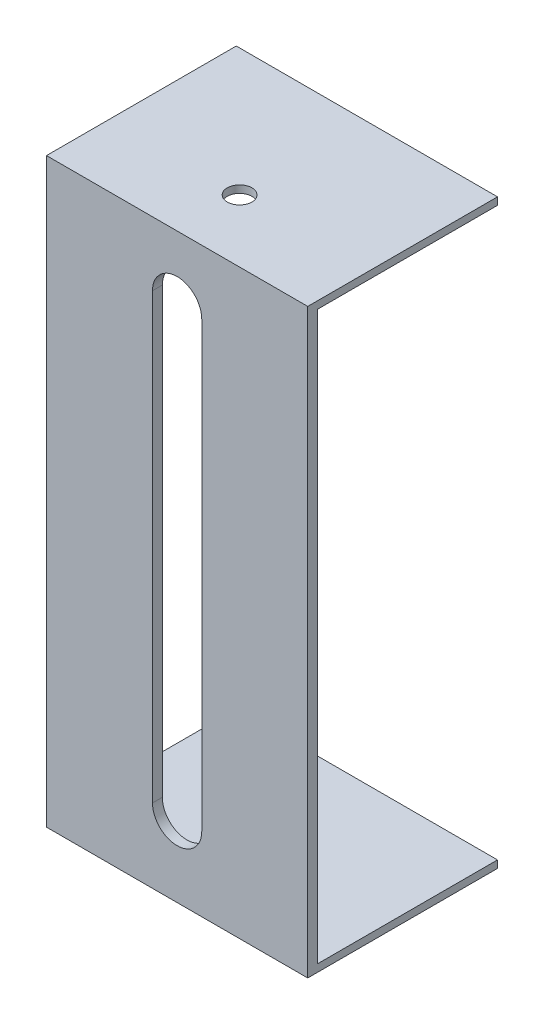
ISO-10303-21;
HEADER;
FILE_DESCRIPTION(('STEP AP214'),'2;1');
FILE_NAME('part.step','',(''),(''),'','','');
FILE_SCHEMA(('AUTOMOTIVE_DESIGN { 1 0 10303 214 1 1 1 1 }'));
ENDSEC;
DATA;
#1=APPLICATION_CONTEXT('core data for automotive mechanical design processes');
#2=APPLICATION_PROTOCOL_DEFINITION('international standard','automotive_design',2000,#1);
#3=PRODUCT_CONTEXT('',#1,'mechanical');
#4=PRODUCT('Part','Part','',(#3));
#5=PRODUCT_RELATED_PRODUCT_CATEGORY('part','',(#4));
#6=PRODUCT_DEFINITION_FORMATION('','',#4);
#7=PRODUCT_DEFINITION_CONTEXT('part definition',#1,'design');
#8=PRODUCT_DEFINITION('design','',#6,#7);
#9=PRODUCT_DEFINITION_SHAPE('','',#8);
#10=(LENGTH_UNIT() NAMED_UNIT(*) SI_UNIT(.MILLI.,.METRE.));
#11=(NAMED_UNIT(*) PLANE_ANGLE_UNIT() SI_UNIT($,.RADIAN.));
#12=(NAMED_UNIT(*) SI_UNIT($,.STERADIAN.) SOLID_ANGLE_UNIT());
#13=UNCERTAINTY_MEASURE_WITH_UNIT(LENGTH_MEASURE(1.E-05),#10,'distance_accuracy_value','');
#14=(GEOMETRIC_REPRESENTATION_CONTEXT(3) GLOBAL_UNCERTAINTY_ASSIGNED_CONTEXT((#13)) GLOBAL_UNIT_ASSIGNED_CONTEXT((#10,
#11,#12)) REPRESENTATION_CONTEXT('',''));
#15=CARTESIAN_POINT('',(0.,0.,0.));
#16=DIRECTION('',(0.,0.,1.));
#17=DIRECTION('',(1.,0.,0.));
#18=AXIS2_PLACEMENT_3D('',#15,#16,#17);
#19=CARTESIAN_POINT('',(0.,0.,0.));
#20=DIRECTION('',(0.,1.,0.));
#21=DIRECTION('',(0.,0.,1.));
#22=AXIS2_PLACEMENT_3D('',#19,#20,#21);
#23=PLANE('',#22);
#24=DIRECTION('',(-1.,0.,0.));
#25=VECTOR('',#24,1.);
#26=CARTESIAN_POINT('',(-42.,0.,-31.5));
#27=LINE('',#26,#25);
#28=CARTESIAN_POINT('',(42.,0.,-31.5));
#29=VERTEX_POINT('',#28);
#30=CARTESIAN_POINT('',(-42.,0.,-31.5));
#31=VERTEX_POINT('',#30);
#32=EDGE_CURVE('E424',#29,#31,#27,.T.);
#33=ORIENTED_EDGE('',*,*,#32,.T.);
#34=DIRECTION('',(0.,0.,1.));
#35=VECTOR('',#34,1.);
#36=CARTESIAN_POINT('',(-42.,0.,-31.5));
#37=LINE('',#36,#35);
#38=CARTESIAN_POINT('',(-42.,0.,31.5));
#39=VERTEX_POINT('',#38);
#40=EDGE_CURVE('E450',#31,#39,#37,.T.);
#41=ORIENTED_EDGE('',*,*,#40,.T.);
#42=DIRECTION('',(1.,0.,0.));
#43=VECTOR('',#42,1.);
#44=CARTESIAN_POINT('',(-42.,0.,31.5));
#45=LINE('',#44,#43);
#46=CARTESIAN_POINT('',(42.,0.,31.5));
#47=VERTEX_POINT('',#46);
#48=EDGE_CURVE('E452',#39,#47,#45,.T.);
#49=ORIENTED_EDGE('',*,*,#48,.T.);
#50=DIRECTION('',(0.,0.,-1.));
#51=VECTOR('',#50,1.);
#52=CARTESIAN_POINT('',(42.,0.,-31.5));
#53=LINE('',#52,#51);
#54=EDGE_CURVE('E431',#47,#29,#53,.T.);
#55=ORIENTED_EDGE('',*,*,#54,.T.);
#56=EDGE_LOOP('',(#33,#41,#49,#55));
#57=FACE_BOUND('',#56,.T.);
#58=DIRECTION('',(1.,0.,0.));
#59=VECTOR('',#58,1.);
#60=CARTESIAN_POINT('',(0.,0.,32.5));
#61=LINE('',#60,#59);
#62=CARTESIAN_POINT('',(-45.,0.,32.5));
#63=VERTEX_POINT('',#62);
#64=CARTESIAN_POINT('',(45.,0.,32.5));
#65=VERTEX_POINT('',#64);
#66=EDGE_CURVE('E318',#63,#65,#61,.T.);
#67=ORIENTED_EDGE('',*,*,#66,.F.);
#68=DIRECTION('',(0.,0.,1.));
#69=VECTOR('',#68,1.);
#70=CARTESIAN_POINT('',(-45.,0.,-34.5));
#71=LINE('',#70,#69);
#72=CARTESIAN_POINT('',(-45.,0.,-34.5));
#73=VERTEX_POINT('',#72);
#74=EDGE_CURVE('E476',#73,#63,#71,.T.);
#75=ORIENTED_EDGE('',*,*,#74,.F.);
#76=DIRECTION('',(-1.,0.,0.));
#77=VECTOR('',#76,1.);
#78=CARTESIAN_POINT('',(-45.,0.,-34.5));
#79=LINE('',#78,#77);
#80=CARTESIAN_POINT('',(45.,0.,-34.5));
#81=VERTEX_POINT('',#80);
#82=EDGE_CURVE('E486',#81,#73,#79,.T.);
#83=ORIENTED_EDGE('',*,*,#82,.F.);
#84=DIRECTION('',(0.,0.,-1.));
#85=VECTOR('',#84,1.);
#86=CARTESIAN_POINT('',(45.,0.,-34.5));
#87=LINE('',#86,#85);
#88=EDGE_CURVE('E472',#65,#81,#87,.T.);
#89=ORIENTED_EDGE('',*,*,#88,.F.);
#90=EDGE_LOOP('',(#67,#75,#83,#89));
#91=FACE_BOUND('',#90,.T.);
#92=ADVANCED_FACE('F50',(#57,#91),#23,.F.);
#93=CARTESIAN_POINT('',(283.034779979028,3.,34.4999999999999));
#94=DIRECTION('',(0.,0.,-1.));
#95=DIRECTION('',(-1.,0.,0.));
#96=AXIS2_PLACEMENT_3D('',#93,#94,#95);
#97=PLANE('',#96);
#98=DIRECTION('',(-1.,0.,0.));
#99=VECTOR('',#98,1.);
#100=CARTESIAN_POINT('',(0.,-219.,34.5));
#101=LINE('',#100,#99);
#102=CARTESIAN_POINT('',(45.,-219.,34.5));
#103=VERTEX_POINT('',#102);
#104=CARTESIAN_POINT('',(-45.,-219.,34.5));
#105=VERTEX_POINT('',#104);
#106=EDGE_CURVE('E301',#103,#105,#101,.T.);
#107=ORIENTED_EDGE('',*,*,#106,.F.);
#108=DIRECTION('',(0.,-1.,0.));
#109=VECTOR('',#108,1.);
#110=CARTESIAN_POINT('',(45.,3.,34.5));
#111=LINE('',#110,#109);
#112=CARTESIAN_POINT('',(45.,3.,34.5));
#113=VERTEX_POINT('',#112);
#114=EDGE_CURVE('E483',#113,#103,#111,.T.);
#115=ORIENTED_EDGE('',*,*,#114,.F.);
#116=DIRECTION('',(-1.,0.,0.));
#117=VECTOR('',#116,1.);
#118=CARTESIAN_POINT('',(283.034779979028,3.,34.4999999999999));
#119=LINE('',#118,#117);
#120=CARTESIAN_POINT('',(53.,3.,34.5));
#121=VERTEX_POINT('',#120);
#122=EDGE_CURVE('E372',#121,#113,#119,.T.);
#123=ORIENTED_EDGE('',*,*,#122,.F.);
#124=DIRECTION('',(0.,1.,0.));
#125=VECTOR('',#124,1.);
#126=CARTESIAN_POINT('',(53.,3.,34.5));
#127=LINE('',#126,#125);
#128=CARTESIAN_POINT('',(53.,-227.,34.5));
#129=VERTEX_POINT('',#128);
#130=EDGE_CURVE('E373',#129,#121,#127,.T.);
#131=ORIENTED_EDGE('',*,*,#130,.F.);
#132=DIRECTION('',(-1.,0.,0.));
#133=VECTOR('',#132,1.);
#134=CARTESIAN_POINT('',(283.034779979028,-227.,34.4999999999999));
#135=LINE('',#134,#133);
#136=CARTESIAN_POINT('',(-53.,-227.,34.5));
#137=VERTEX_POINT('',#136);
#138=EDGE_CURVE('E367',#129,#137,#135,.T.);
#139=ORIENTED_EDGE('',*,*,#138,.T.);
#140=DIRECTION('',(0.,-1.,0.));
#141=VECTOR('',#140,1.);
#142=CARTESIAN_POINT('',(-53.,3.,34.5));
#143=LINE('',#142,#141);
#144=CARTESIAN_POINT('',(-53.,3.,34.5));
#145=VERTEX_POINT('',#144);
#146=EDGE_CURVE('E347',#145,#137,#143,.T.);
#147=ORIENTED_EDGE('',*,*,#146,.F.);
#148=CARTESIAN_POINT('',(-45.,3.,34.5));
#149=VERTEX_POINT('',#148);
#150=EDGE_CURVE('E368',#149,#145,#119,.T.);
#151=ORIENTED_EDGE('',*,*,#150,.F.);
#152=DIRECTION('',(0.,-1.,0.));
#153=VECTOR('',#152,1.);
#154=CARTESIAN_POINT('',(-45.,3.,34.5));
#155=LINE('',#154,#153);
#156=EDGE_CURVE('E496',#149,#105,#155,.T.);
#157=ORIENTED_EDGE('',*,*,#156,.T.);
#158=EDGE_LOOP('',(#107,#115,#123,#131,#139,#147,#151,#157));
#159=FACE_BOUND('',#158,.T.);
#160=ADVANCED_FACE('F537',(#159),#97,.T.);
#161=CARTESIAN_POINT('',(45.,3.,-34.5));
#162=DIRECTION('',(-1.,0.,0.));
#163=DIRECTION('',(0.,0.,1.));
#164=AXIS2_PLACEMENT_3D('',#161,#162,#163);
#165=PLANE('',#164);
#166=ORIENTED_EDGE('',*,*,#114,.T.);
#167=DIRECTION('',(0.,0.,1.));
#168=VECTOR('',#167,1.);
#169=CARTESIAN_POINT('',(45.,-219.,32.5));
#170=LINE('',#169,#168);
#171=CARTESIAN_POINT('',(45.,-219.,32.5));
#172=VERTEX_POINT('',#171);
#173=EDGE_CURVE('E342',#172,#103,#170,.T.);
#174=ORIENTED_EDGE('',*,*,#173,.F.);
#175=DIRECTION('',(0.,-1.,0.));
#176=VECTOR('',#175,1.);
#177=CARTESIAN_POINT('',(45.,0.,32.5));
#178=LINE('',#177,#176);
#179=EDGE_CURVE('E324',#65,#172,#178,.T.);
#180=ORIENTED_EDGE('',*,*,#179,.F.);
#181=ORIENTED_EDGE('',*,*,#88,.T.);
#182=DIRECTION('',(0.,-1.,0.));
#183=VECTOR('',#182,1.);
#184=CARTESIAN_POINT('',(45.,3.,-34.5));
#185=LINE('',#184,#183);
#186=CARTESIAN_POINT('',(45.,3.,-34.5));
#187=VERTEX_POINT('',#186);
#188=EDGE_CURVE('E503',#187,#81,#185,.T.);
#189=ORIENTED_EDGE('',*,*,#188,.F.);
#190=DIRECTION('',(0.,0.,-1.));
#191=VECTOR('',#190,1.);
#192=CARTESIAN_POINT('',(45.,3.,-34.5));
#193=LINE('',#192,#191);
#194=EDGE_CURVE('E475',#113,#187,#193,.T.);
#195=ORIENTED_EDGE('',*,*,#194,.F.);
#196=EDGE_LOOP('',(#166,#174,#180,#181,#189,#195));
#197=FACE_BOUND('',#196,.T.);
#198=ADVANCED_FACE('F47',(#197),#165,.F.);
#199=CARTESIAN_POINT('',(-45.,3.,-34.5));
#200=DIRECTION('',(0.,0.,1.));
#201=DIRECTION('',(1.,0.,0.));
#202=AXIS2_PLACEMENT_3D('',#199,#200,#201);
#203=PLANE('',#202);
#204=ORIENTED_EDGE('',*,*,#82,.T.);
#205=DIRECTION('',(0.,-1.,0.));
#206=VECTOR('',#205,1.);
#207=CARTESIAN_POINT('',(-45.,3.,-34.5));
#208=LINE('',#207,#206);
#209=CARTESIAN_POINT('',(-45.,3.,-34.5));
#210=VERTEX_POINT('',#209);
#211=EDGE_CURVE('E497',#210,#73,#208,.T.);
#212=ORIENTED_EDGE('',*,*,#211,.F.);
#213=DIRECTION('',(-1.,0.,0.));
#214=VECTOR('',#213,1.);
#215=CARTESIAN_POINT('',(-45.,3.,-34.5));
#216=LINE('',#215,#214);
#217=EDGE_CURVE('E479',#187,#210,#216,.T.);
#218=ORIENTED_EDGE('',*,*,#217,.F.);
#219=ORIENTED_EDGE('',*,*,#188,.T.);
#220=EDGE_LOOP('',(#204,#212,#218,#219));
#221=FACE_BOUND('',#220,.T.);
#222=ADVANCED_FACE('F551',(#221),#203,.F.);
#223=CARTESIAN_POINT('',(-45.,3.,-34.5));
#224=DIRECTION('',(1.,0.,0.));
#225=DIRECTION('',(0.,0.,-1.));
#226=AXIS2_PLACEMENT_3D('',#223,#224,#225);
#227=PLANE('',#226);
#228=ORIENTED_EDGE('',*,*,#74,.T.);
#229=DIRECTION('',(0.,1.,0.));
#230=VECTOR('',#229,1.);
#231=CARTESIAN_POINT('',(-45.,0.,32.5));
#232=LINE('',#231,#230);
#233=CARTESIAN_POINT('',(-45.,-219.,32.5));
#234=VERTEX_POINT('',#233);
#235=EDGE_CURVE('E320',#234,#63,#232,.T.);
#236=ORIENTED_EDGE('',*,*,#235,.F.);
#237=DIRECTION('',(0.,0.,1.));
#238=VECTOR('',#237,1.);
#239=CARTESIAN_POINT('',(-45.,-219.,32.5));
#240=LINE('',#239,#238);
#241=EDGE_CURVE('E343',#234,#105,#240,.T.);
#242=ORIENTED_EDGE('',*,*,#241,.T.);
#243=ORIENTED_EDGE('',*,*,#156,.F.);
#244=DIRECTION('',(0.,0.,1.));
#245=VECTOR('',#244,1.);
#246=CARTESIAN_POINT('',(-45.,3.,-34.5));
#247=LINE('',#246,#245);
#248=EDGE_CURVE('E482',#210,#149,#247,.T.);
#249=ORIENTED_EDGE('',*,*,#248,.F.);
#250=ORIENTED_EDGE('',*,*,#211,.T.);
#251=EDGE_LOOP('',(#228,#236,#242,#243,#249,#250));
#252=FACE_BOUND('',#251,.T.);
#253=ADVANCED_FACE('F553',(#252),#227,.F.);
#254=CARTESIAN_POINT('',(-42.,3.,-31.5));
#255=DIRECTION('',(0.,0.,1.));
#256=DIRECTION('',(1.,0.,0.));
#257=AXIS2_PLACEMENT_3D('',#254,#255,#256);
#258=PLANE('',#257);
#259=ORIENTED_EDGE('',*,*,#32,.F.);
#260=DIRECTION('',(0.,-1.,0.));
#261=VECTOR('',#260,1.);
#262=CARTESIAN_POINT('',(42.,3.,-31.5));
#263=LINE('',#262,#261);
#264=CARTESIAN_POINT('',(42.,3.,-31.5));
#265=VERTEX_POINT('',#264);
#266=EDGE_CURVE('E442',#265,#29,#263,.T.);
#267=ORIENTED_EDGE('',*,*,#266,.F.);
#268=DIRECTION('',(-1.,0.,0.));
#269=VECTOR('',#268,1.);
#270=CARTESIAN_POINT('',(-42.,3.,-31.5));
#271=LINE('',#270,#269);
#272=CARTESIAN_POINT('',(-42.,3.,-31.5));
#273=VERTEX_POINT('',#272);
#274=EDGE_CURVE('E428',#265,#273,#271,.T.);
#275=ORIENTED_EDGE('',*,*,#274,.T.);
#276=DIRECTION('',(0.,-1.,0.));
#277=VECTOR('',#276,1.);
#278=CARTESIAN_POINT('',(-42.,3.,-31.5));
#279=LINE('',#278,#277);
#280=EDGE_CURVE('E470',#273,#31,#279,.T.);
#281=ORIENTED_EDGE('',*,*,#280,.T.);
#282=EDGE_LOOP('',(#259,#267,#275,#281));
#283=FACE_BOUND('',#282,.T.);
#284=ADVANCED_FACE('F546',(#283),#258,.T.);
#285=CARTESIAN_POINT('',(-42.,3.,-31.5));
#286=DIRECTION('',(1.,0.,0.));
#287=DIRECTION('',(0.,0.,-1.));
#288=AXIS2_PLACEMENT_3D('',#285,#286,#287);
#289=PLANE('',#288);
#290=ORIENTED_EDGE('',*,*,#40,.F.);
#291=ORIENTED_EDGE('',*,*,#280,.F.);
#292=DIRECTION('',(0.,0.,1.));
#293=VECTOR('',#292,1.);
#294=CARTESIAN_POINT('',(-42.,3.,-31.5));
#295=LINE('',#294,#293);
#296=CARTESIAN_POINT('',(-42.,3.,31.5));
#297=VERTEX_POINT('',#296);
#298=EDGE_CURVE('E427',#273,#297,#295,.T.);
#299=ORIENTED_EDGE('',*,*,#298,.T.);
#300=DIRECTION('',(0.,-1.,0.));
#301=VECTOR('',#300,1.);
#302=CARTESIAN_POINT('',(-42.,3.,31.5));
#303=LINE('',#302,#301);
#304=EDGE_CURVE('E461',#297,#39,#303,.T.);
#305=ORIENTED_EDGE('',*,*,#304,.T.);
#306=EDGE_LOOP('',(#290,#291,#299,#305));
#307=FACE_BOUND('',#306,.T.);
#308=ADVANCED_FACE('F647',(#307),#289,.T.);
#309=CARTESIAN_POINT('',(-42.,3.,31.5));
#310=DIRECTION('',(0.,0.,-1.));
#311=DIRECTION('',(-1.,0.,0.));
#312=AXIS2_PLACEMENT_3D('',#309,#310,#311);
#313=PLANE('',#312);
#314=ORIENTED_EDGE('',*,*,#48,.F.);
#315=ORIENTED_EDGE('',*,*,#304,.F.);
#316=DIRECTION('',(1.,0.,0.));
#317=VECTOR('',#316,1.);
#318=CARTESIAN_POINT('',(-42.,3.,31.5));
#319=LINE('',#318,#317);
#320=CARTESIAN_POINT('',(42.,3.,31.5));
#321=VERTEX_POINT('',#320);
#322=EDGE_CURVE('E434',#297,#321,#319,.T.);
#323=ORIENTED_EDGE('',*,*,#322,.T.);
#324=DIRECTION('',(0.,-1.,0.));
#325=VECTOR('',#324,1.);
#326=CARTESIAN_POINT('',(42.,3.,31.5));
#327=LINE('',#326,#325);
#328=EDGE_CURVE('E462',#321,#47,#327,.T.);
#329=ORIENTED_EDGE('',*,*,#328,.T.);
#330=EDGE_LOOP('',(#314,#315,#323,#329));
#331=FACE_BOUND('',#330,.T.);
#332=ADVANCED_FACE('F639',(#331),#313,.T.);
#333=CARTESIAN_POINT('',(42.,3.,-31.5));
#334=DIRECTION('',(-1.,0.,0.));
#335=DIRECTION('',(0.,0.,1.));
#336=AXIS2_PLACEMENT_3D('',#333,#334,#335);
#337=PLANE('',#336);
#338=ORIENTED_EDGE('',*,*,#54,.F.);
#339=ORIENTED_EDGE('',*,*,#328,.F.);
#340=DIRECTION('',(0.,0.,-1.));
#341=VECTOR('',#340,1.);
#342=CARTESIAN_POINT('',(42.,3.,-31.5));
#343=LINE('',#342,#341);
#344=EDGE_CURVE('E437',#321,#265,#343,.T.);
#345=ORIENTED_EDGE('',*,*,#344,.T.);
#346=ORIENTED_EDGE('',*,*,#266,.T.);
#347=EDGE_LOOP('',(#338,#339,#345,#346));
#348=FACE_BOUND('',#347,.T.);
#349=ADVANCED_FACE('F636',(#348),#337,.T.);
#350=CARTESIAN_POINT('',(0.,3.,0.));
#351=DIRECTION('',(0.,1.,0.));
#352=DIRECTION('',(0.,0.,1.));
#353=AXIS2_PLACEMENT_3D('',#350,#351,#352);
#354=PLANE('',#353);
#355=DIRECTION('',(0.,0.,-1.));
#356=VECTOR('',#355,1.);
#357=CARTESIAN_POINT('',(53.,3.,-38.5));
#358=LINE('',#357,#356);
#359=CARTESIAN_POINT('',(53.,3.,-38.5));
#360=VERTEX_POINT('',#359);
#361=EDGE_CURVE('E383',#121,#360,#358,.T.);
#362=ORIENTED_EDGE('',*,*,#361,.F.);
#363=ORIENTED_EDGE('',*,*,#122,.T.);
#364=ORIENTED_EDGE('',*,*,#194,.T.);
#365=ORIENTED_EDGE('',*,*,#217,.T.);
#366=ORIENTED_EDGE('',*,*,#248,.T.);
#367=ORIENTED_EDGE('',*,*,#150,.T.);
#368=DIRECTION('',(0.,0.,1.));
#369=VECTOR('',#368,1.);
#370=CARTESIAN_POINT('',(-53.,3.,-38.5));
#371=LINE('',#370,#369);
#372=CARTESIAN_POINT('',(-53.,3.,-38.5));
#373=VERTEX_POINT('',#372);
#374=EDGE_CURVE('E393',#373,#145,#371,.T.);
#375=ORIENTED_EDGE('',*,*,#374,.F.);
#376=DIRECTION('',(-1.,0.,0.));
#377=VECTOR('',#376,1.);
#378=CARTESIAN_POINT('',(-53.,3.,-38.5));
#379=LINE('',#378,#377);
#380=EDGE_CURVE('E407',#360,#373,#379,.T.);
#381=ORIENTED_EDGE('',*,*,#380,.F.);
#382=EDGE_LOOP('',(#362,#363,#364,#365,#366,#367,#375,#381));
#383=FACE_BOUND('',#382,.T.);
#384=ADVANCED_FACE('F578',(#383),#354,.F.);
#385=CARTESIAN_POINT('',(0.,6.,0.));
#386=DIRECTION('',(0.,1.,0.));
#387=DIRECTION('',(0.,0.,1.));
#388=AXIS2_PLACEMENT_3D('',#385,#386,#387);
#389=PLANE('',#388);
#390=DIRECTION('',(0.,0.,-1.));
#391=VECTOR('',#390,1.);
#392=CARTESIAN_POINT('',(53.,6.,-38.5));
#393=LINE('',#392,#391);
#394=CARTESIAN_POINT('',(53.,6.,38.5));
#395=VERTEX_POINT('',#394);
#396=CARTESIAN_POINT('',(53.,6.,-38.5));
#397=VERTEX_POINT('',#396);
#398=EDGE_CURVE('E386',#395,#397,#393,.T.);
#399=ORIENTED_EDGE('',*,*,#398,.T.);
#400=DIRECTION('',(-1.,0.,0.));
#401=VECTOR('',#400,1.);
#402=CARTESIAN_POINT('',(-53.,6.,-38.5));
#403=LINE('',#402,#401);
#404=CARTESIAN_POINT('',(-53.,6.,-38.5));
#405=VERTEX_POINT('',#404);
#406=EDGE_CURVE('E395',#397,#405,#403,.T.);
#407=ORIENTED_EDGE('',*,*,#406,.T.);
#408=DIRECTION('',(0.,0.,1.));
#409=VECTOR('',#408,1.);
#410=CARTESIAN_POINT('',(-53.,6.,-38.5));
#411=LINE('',#410,#409);
#412=CARTESIAN_POINT('',(-53.,6.,38.5));
#413=VERTEX_POINT('',#412);
#414=EDGE_CURVE('E400',#405,#413,#411,.T.);
#415=ORIENTED_EDGE('',*,*,#414,.T.);
#416=DIRECTION('',(1.,0.,0.));
#417=VECTOR('',#416,1.);
#418=CARTESIAN_POINT('',(-53.,6.,38.5));
#419=LINE('',#418,#417);
#420=EDGE_CURVE('E398',#413,#395,#419,.T.);
#421=ORIENTED_EDGE('',*,*,#420,.T.);
#422=EDGE_LOOP('',(#399,#407,#415,#421));
#423=FACE_BOUND('',#422,.T.);
#424=CARTESIAN_POINT('',(0.,6.,13.15));
#425=DIRECTION('',(0.,1.,0.));
#426=DIRECTION('',(0.,0.,1.));
#427=AXIS2_PLACEMENT_3D('',#424,#425,#426);
#428=CIRCLE('',#427,5.);
#429=CARTESIAN_POINT('',(0.,6.,18.15));
#430=VERTEX_POINT('',#429);
#431=EDGE_CURVE('E382',#430,#430,#428,.T.);
#432=ORIENTED_EDGE('',*,*,#431,.F.);
#433=EDGE_LOOP('',(#432));
#434=FACE_BOUND('',#433,.T.);
#435=ADVANCED_FACE('F611',(#423,#434),#389,.T.);
#436=ORIENTED_EDGE('',*,*,#298,.F.);
#437=ORIENTED_EDGE('',*,*,#274,.F.);
#438=ORIENTED_EDGE('',*,*,#344,.F.);
#439=ORIENTED_EDGE('',*,*,#322,.F.);
#440=EDGE_LOOP('',(#436,#437,#438,#439));
#441=FACE_BOUND('',#440,.T.);
#442=CARTESIAN_POINT('',(0.,3.,13.15));
#443=DIRECTION('',(0.,1.,0.));
#444=DIRECTION('',(0.,0.,1.));
#445=AXIS2_PLACEMENT_3D('',#442,#443,#444);
#446=CIRCLE('',#445,5.);
#447=CARTESIAN_POINT('',(0.,3.,18.15));
#448=VERTEX_POINT('',#447);
#449=EDGE_CURVE('E379',#448,#448,#446,.T.);
#450=ORIENTED_EDGE('',*,*,#449,.T.);
#451=EDGE_LOOP('',(#450));
#452=FACE_BOUND('',#451,.T.);
#453=ADVANCED_FACE('F617',(#441,#452),#354,.F.);
#454=CARTESIAN_POINT('',(53.,6.,-38.5));
#455=DIRECTION('',(-1.,0.,0.));
#456=DIRECTION('',(0.,0.,1.));
#457=AXIS2_PLACEMENT_3D('',#454,#455,#456);
#458=PLANE('',#457);
#459=DIRECTION('',(0.,-1.,0.));
#460=VECTOR('',#459,1.);
#461=CARTESIAN_POINT('',(53.,6.,38.5));
#462=LINE('',#461,#460);
#463=CARTESIAN_POINT('',(53.,-230.,38.5));
#464=VERTEX_POINT('',#463);
#465=EDGE_CURVE('E401',#395,#464,#462,.T.);
#466=ORIENTED_EDGE('',*,*,#465,.T.);
#467=DIRECTION('',(0.,0.,-1.));
#468=VECTOR('',#467,1.);
#469=CARTESIAN_POINT('',(53.,-230.,-38.5));
#470=LINE('',#469,#468);
#471=CARTESIAN_POINT('',(53.,-230.,-38.5));
#472=VERTEX_POINT('',#471);
#473=EDGE_CURVE('E263',#464,#472,#470,.T.);
#474=ORIENTED_EDGE('',*,*,#473,.T.);
#475=DIRECTION('',(0.,1.,0.));
#476=VECTOR('',#475,1.);
#477=CARTESIAN_POINT('',(53.,-227.,-38.5));
#478=LINE('',#477,#476);
#479=CARTESIAN_POINT('',(53.,-227.,-38.5));
#480=VERTEX_POINT('',#479);
#481=EDGE_CURVE('E275',#472,#480,#478,.T.);
#482=ORIENTED_EDGE('',*,*,#481,.T.);
#483=DIRECTION('',(0.,0.,1.));
#484=VECTOR('',#483,1.);
#485=CARTESIAN_POINT('',(53.,-227.,-38.5));
#486=LINE('',#485,#484);
#487=EDGE_CURVE('E270',#480,#129,#486,.T.);
#488=ORIENTED_EDGE('',*,*,#487,.T.);
#489=ORIENTED_EDGE('',*,*,#130,.T.);
#490=ORIENTED_EDGE('',*,*,#361,.T.);
#491=DIRECTION('',(0.,-1.,0.));
#492=VECTOR('',#491,1.);
#493=CARTESIAN_POINT('',(53.,6.,-38.5));
#494=LINE('',#493,#492);
#495=EDGE_CURVE('E423',#397,#360,#494,.T.);
#496=ORIENTED_EDGE('',*,*,#495,.F.);
#497=ORIENTED_EDGE('',*,*,#398,.F.);
#498=EDGE_LOOP('',(#466,#474,#482,#488,#489,#490,#496,#497));
#499=FACE_BOUND('',#498,.T.);
#500=ADVANCED_FACE('F593',(#499),#458,.F.);
#501=CARTESIAN_POINT('',(-53.,6.,-38.5));
#502=DIRECTION('',(0.,0.,1.));
#503=DIRECTION('',(1.,0.,0.));
#504=AXIS2_PLACEMENT_3D('',#501,#502,#503);
#505=PLANE('',#504);
#506=ORIENTED_EDGE('',*,*,#380,.T.);
#507=DIRECTION('',(0.,-1.,0.));
#508=VECTOR('',#507,1.);
#509=CARTESIAN_POINT('',(-53.,6.,-38.5));
#510=LINE('',#509,#508);
#511=EDGE_CURVE('E420',#405,#373,#510,.T.);
#512=ORIENTED_EDGE('',*,*,#511,.F.);
#513=ORIENTED_EDGE('',*,*,#406,.F.);
#514=ORIENTED_EDGE('',*,*,#495,.T.);
#515=EDGE_LOOP('',(#506,#512,#513,#514));
#516=FACE_BOUND('',#515,.T.);
#517=ADVANCED_FACE('F595',(#516),#505,.F.);
#518=CARTESIAN_POINT('',(-53.,6.,-38.5));
#519=DIRECTION('',(1.,0.,0.));
#520=DIRECTION('',(0.,0.,-1.));
#521=AXIS2_PLACEMENT_3D('',#518,#519,#520);
#522=PLANE('',#521);
#523=ORIENTED_EDGE('',*,*,#374,.T.);
#524=ORIENTED_EDGE('',*,*,#146,.T.);
#525=DIRECTION('',(0.,0.,-1.));
#526=VECTOR('',#525,1.);
#527=CARTESIAN_POINT('',(-53.,-227.,-38.5));
#528=LINE('',#527,#526);
#529=CARTESIAN_POINT('',(-53.,-227.,-38.5));
#530=VERTEX_POINT('',#529);
#531=EDGE_CURVE('E265',#137,#530,#528,.T.);
#532=ORIENTED_EDGE('',*,*,#531,.T.);
#533=DIRECTION('',(0.,-1.,0.));
#534=VECTOR('',#533,1.);
#535=CARTESIAN_POINT('',(-53.,-227.,-38.5));
#536=LINE('',#535,#534);
#537=CARTESIAN_POINT('',(-53.,-230.,-38.5));
#538=VERTEX_POINT('',#537);
#539=EDGE_CURVE('E273',#530,#538,#536,.T.);
#540=ORIENTED_EDGE('',*,*,#539,.T.);
#541=DIRECTION('',(0.,0.,1.));
#542=VECTOR('',#541,1.);
#543=CARTESIAN_POINT('',(-53.,-230.,-38.5));
#544=LINE('',#543,#542);
#545=CARTESIAN_POINT('',(-53.,-230.,38.5));
#546=VERTEX_POINT('',#545);
#547=EDGE_CURVE('E276',#538,#546,#544,.T.);
#548=ORIENTED_EDGE('',*,*,#547,.T.);
#549=DIRECTION('',(0.,-1.,0.));
#550=VECTOR('',#549,1.);
#551=CARTESIAN_POINT('',(-53.,6.,38.5));
#552=LINE('',#551,#550);
#553=EDGE_CURVE('E413',#413,#546,#552,.T.);
#554=ORIENTED_EDGE('',*,*,#553,.F.);
#555=ORIENTED_EDGE('',*,*,#414,.F.);
#556=ORIENTED_EDGE('',*,*,#511,.T.);
#557=EDGE_LOOP('',(#523,#524,#532,#540,#548,#554,#555,#556));
#558=FACE_BOUND('',#557,.T.);
#559=ADVANCED_FACE('F589',(#558),#522,.F.);
#560=CARTESIAN_POINT('',(-53.,6.,38.5));
#561=DIRECTION('',(0.,0.,-1.));
#562=DIRECTION('',(-1.,0.,0.));
#563=AXIS2_PLACEMENT_3D('',#560,#561,#562);
#564=PLANE('',#563);
#565=DIRECTION('',(0.,-1.,0.));
#566=VECTOR('',#565,1.);
#567=CARTESIAN_POINT('',(-10.,-20.0000000000002,38.5));
#568=LINE('',#567,#566);
#569=CARTESIAN_POINT('',(-10.,-20.0000000000002,38.5));
#570=VERTEX_POINT('',#569);
#571=CARTESIAN_POINT('',(-9.99999999999999,-200.,38.5));
#572=VERTEX_POINT('',#571);
#573=EDGE_CURVE('E231',#570,#572,#568,.T.);
#574=ORIENTED_EDGE('',*,*,#573,.F.);
#575=CARTESIAN_POINT('',(0.,-20.0000000000002,38.5));
#576=DIRECTION('',(0.,0.,1.));
#577=DIRECTION('',(1.,0.,0.));
#578=AXIS2_PLACEMENT_3D('',#575,#576,#577);
#579=CIRCLE('',#578,10.);
#580=CARTESIAN_POINT('',(10.,-20.0000000000002,38.5));
#581=VERTEX_POINT('',#580);
#582=EDGE_CURVE('E64',#581,#570,#579,.T.);
#583=ORIENTED_EDGE('',*,*,#582,.F.);
#584=DIRECTION('',(0.,1.,0.));
#585=VECTOR('',#584,1.);
#586=CARTESIAN_POINT('',(10.,-20.0000000000002,38.5));
#587=LINE('',#586,#585);
#588=CARTESIAN_POINT('',(10.,-200.,38.5));
#589=VERTEX_POINT('',#588);
#590=EDGE_CURVE('E241',#589,#581,#587,.T.);
#591=ORIENTED_EDGE('',*,*,#590,.F.);
#592=CARTESIAN_POINT('',(0.,-200.,38.5));
#593=DIRECTION('',(0.,0.,1.));
#594=DIRECTION('',(1.,0.,0.));
#595=AXIS2_PLACEMENT_3D('',#592,#593,#594);
#596=CIRCLE('',#595,10.);
#597=EDGE_CURVE('E224',#572,#589,#596,.T.);
#598=ORIENTED_EDGE('',*,*,#597,.F.);
#599=EDGE_LOOP('',(#574,#583,#591,#598));
#600=FACE_BOUND('',#599,.T.);
#601=ORIENTED_EDGE('',*,*,#553,.T.);
#602=DIRECTION('',(-1.,0.,0.));
#603=VECTOR('',#602,1.);
#604=CARTESIAN_POINT('',(130.058419397234,-230.,38.5));
#605=LINE('',#604,#603);
#606=EDGE_CURVE('E269',#464,#546,#605,.T.);
#607=ORIENTED_EDGE('',*,*,#606,.F.);
#608=ORIENTED_EDGE('',*,*,#465,.F.);
#609=ORIENTED_EDGE('',*,*,#420,.F.);
#610=EDGE_LOOP('',(#601,#607,#608,#609));
#611=FACE_BOUND('',#610,.T.);
#612=ADVANCED_FACE('F238',(#600,#611),#564,.F.);
#613=CARTESIAN_POINT('',(0.,6.,13.15));
#614=DIRECTION('',(0.,-1.,0.));
#615=DIRECTION('',(0.,0.,-1.));
#616=AXIS2_PLACEMENT_3D('',#613,#614,#615);
#617=CYLINDRICAL_SURFACE('',#616,5.);
#618=ORIENTED_EDGE('',*,*,#431,.T.);
#619=EDGE_LOOP('',(#618));
#620=FACE_BOUND('',#619,.T.);
#621=ORIENTED_EDGE('',*,*,#449,.F.);
#622=EDGE_LOOP('',(#621));
#623=FACE_BOUND('',#622,.T.);
#624=ADVANCED_FACE('F623',(#620,#623),#617,.F.);
#625=CARTESIAN_POINT('',(0.,-219.,32.5));
#626=DIRECTION('',(0.,1.,0.));
#627=DIRECTION('',(0.,0.,1.));
#628=AXIS2_PLACEMENT_3D('',#625,#626,#627);
#629=PLANE('',#628);
#630=ORIENTED_EDGE('',*,*,#106,.T.);
#631=ORIENTED_EDGE('',*,*,#241,.F.);
#632=DIRECTION('',(-1.,0.,0.));
#633=VECTOR('',#632,1.);
#634=CARTESIAN_POINT('',(0.,-219.,32.5));
#635=LINE('',#634,#633);
#636=EDGE_CURVE('E312',#172,#234,#635,.T.);
#637=ORIENTED_EDGE('',*,*,#636,.F.);
#638=ORIENTED_EDGE('',*,*,#173,.T.);
#639=EDGE_LOOP('',(#630,#631,#637,#638));
#640=FACE_BOUND('',#639,.T.);
#641=ADVANCED_FACE('F580',(#640),#629,.F.);
#642=CARTESIAN_POINT('',(0.,-3.,32.5));
#643=DIRECTION('',(0.,-1.,0.));
#644=DIRECTION('',(0.,0.,-1.));
#645=AXIS2_PLACEMENT_3D('',#642,#643,#644);
#646=PLANE('',#645);
#647=DIRECTION('',(1.,0.,0.));
#648=VECTOR('',#647,1.);
#649=CARTESIAN_POINT('',(0.,-3.,34.5));
#650=LINE('',#649,#648);
#651=CARTESIAN_POINT('',(-42.,-3.,34.5));
#652=VERTEX_POINT('',#651);
#653=CARTESIAN_POINT('',(42.,-3.,34.5));
#654=VERTEX_POINT('',#653);
#655=EDGE_CURVE('E294',#652,#654,#650,.T.);
#656=ORIENTED_EDGE('',*,*,#655,.F.);
#657=DIRECTION('',(0.,0.,1.));
#658=VECTOR('',#657,1.);
#659=CARTESIAN_POINT('',(-42.,-3.,32.5));
#660=LINE('',#659,#658);
#661=CARTESIAN_POINT('',(-42.,-3.,32.5));
#662=VERTEX_POINT('',#661);
#663=EDGE_CURVE('E349',#662,#652,#660,.T.);
#664=ORIENTED_EDGE('',*,*,#663,.F.);
#665=DIRECTION('',(1.,0.,0.));
#666=VECTOR('',#665,1.);
#667=CARTESIAN_POINT('',(0.,-3.,32.5));
#668=LINE('',#667,#666);
#669=CARTESIAN_POINT('',(42.,-3.,32.5));
#670=VERTEX_POINT('',#669);
#671=EDGE_CURVE('E298',#662,#670,#668,.T.);
#672=ORIENTED_EDGE('',*,*,#671,.T.);
#673=DIRECTION('',(0.,0.,1.));
#674=VECTOR('',#673,1.);
#675=CARTESIAN_POINT('',(42.,-3.,32.5));
#676=LINE('',#675,#674);
#677=EDGE_CURVE('E329',#670,#654,#676,.T.);
#678=ORIENTED_EDGE('',*,*,#677,.T.);
#679=EDGE_LOOP('',(#656,#664,#672,#678));
#680=FACE_BOUND('',#679,.T.);
#681=ADVANCED_FACE('F762',(#680),#646,.T.);
#682=CARTESIAN_POINT('',(-42.,0.,32.5));
#683=DIRECTION('',(1.,0.,0.));
#684=DIRECTION('',(0.,0.,-1.));
#685=AXIS2_PLACEMENT_3D('',#682,#683,#684);
#686=PLANE('',#685);
#687=DIRECTION('',(0.,1.,0.));
#688=VECTOR('',#687,1.);
#689=CARTESIAN_POINT('',(-42.,0.,34.5));
#690=LINE('',#689,#688);
#691=CARTESIAN_POINT('',(-42.,-216.,34.5));
#692=VERTEX_POINT('',#691);
#693=EDGE_CURVE('E328',#692,#652,#690,.T.);
#694=ORIENTED_EDGE('',*,*,#693,.F.);
#695=DIRECTION('',(0.,0.,1.));
#696=VECTOR('',#695,1.);
#697=CARTESIAN_POINT('',(-42.,-216.,32.5));
#698=LINE('',#697,#696);
#699=CARTESIAN_POINT('',(-42.,-216.,32.5));
#700=VERTEX_POINT('',#699);
#701=EDGE_CURVE('E356',#700,#692,#698,.T.);
#702=ORIENTED_EDGE('',*,*,#701,.F.);
#703=DIRECTION('',(0.,1.,0.));
#704=VECTOR('',#703,1.);
#705=CARTESIAN_POINT('',(-42.,0.,32.5));
#706=LINE('',#705,#704);
#707=EDGE_CURVE('E297',#700,#662,#706,.T.);
#708=ORIENTED_EDGE('',*,*,#707,.T.);
#709=ORIENTED_EDGE('',*,*,#663,.T.);
#710=EDGE_LOOP('',(#694,#702,#708,#709));
#711=FACE_BOUND('',#710,.T.);
#712=ADVANCED_FACE('F775',(#711),#686,.T.);
#713=CARTESIAN_POINT('',(0.,-216.,32.5));
#714=DIRECTION('',(0.,1.,0.));
#715=DIRECTION('',(-1.,0.,0.));
#716=AXIS2_PLACEMENT_3D('',#713,#714,#715);
#717=PLANE('',#716);
#718=DIRECTION('',(-1.,0.,0.));
#719=VECTOR('',#718,1.);
#720=CARTESIAN_POINT('',(0.,-216.,34.5));
#721=LINE('',#720,#719);
#722=CARTESIAN_POINT('',(42.,-216.,34.5));
#723=VERTEX_POINT('',#722);
#724=EDGE_CURVE('E335',#723,#692,#721,.T.);
#725=ORIENTED_EDGE('',*,*,#724,.F.);
#726=DIRECTION('',(0.,0.,1.));
#727=VECTOR('',#726,1.);
#728=CARTESIAN_POINT('',(42.,-216.,32.5));
#729=LINE('',#728,#727);
#730=CARTESIAN_POINT('',(42.,-216.,32.5));
#731=VERTEX_POINT('',#730);
#732=EDGE_CURVE('E351',#731,#723,#729,.T.);
#733=ORIENTED_EDGE('',*,*,#732,.F.);
#734=DIRECTION('',(-1.,0.,0.));
#735=VECTOR('',#734,1.);
#736=CARTESIAN_POINT('',(0.,-216.,32.5));
#737=LINE('',#736,#735);
#738=EDGE_CURVE('E304',#731,#700,#737,.T.);
#739=ORIENTED_EDGE('',*,*,#738,.T.);
#740=ORIENTED_EDGE('',*,*,#701,.T.);
#741=EDGE_LOOP('',(#725,#733,#739,#740));
#742=FACE_BOUND('',#741,.T.);
#743=ADVANCED_FACE('F784',(#742),#717,.T.);
#744=CARTESIAN_POINT('',(42.,0.,32.5));
#745=DIRECTION('',(-1.,0.,0.));
#746=DIRECTION('',(0.,0.,1.));
#747=AXIS2_PLACEMENT_3D('',#744,#745,#746);
#748=PLANE('',#747);
#749=DIRECTION('',(0.,-1.,0.));
#750=VECTOR('',#749,1.);
#751=CARTESIAN_POINT('',(42.,0.,34.5));
#752=LINE('',#751,#750);
#753=EDGE_CURVE('E333',#654,#723,#752,.T.);
#754=ORIENTED_EDGE('',*,*,#753,.F.);
#755=ORIENTED_EDGE('',*,*,#677,.F.);
#756=DIRECTION('',(0.,-1.,0.));
#757=VECTOR('',#756,1.);
#758=CARTESIAN_POINT('',(42.,0.,32.5));
#759=LINE('',#758,#757);
#760=EDGE_CURVE('E307',#670,#731,#759,.T.);
#761=ORIENTED_EDGE('',*,*,#760,.T.);
#762=ORIENTED_EDGE('',*,*,#732,.T.);
#763=EDGE_LOOP('',(#754,#755,#761,#762));
#764=FACE_BOUND('',#763,.T.);
#765=ADVANCED_FACE('F788',(#764),#748,.T.);
#766=CARTESIAN_POINT('',(0.,0.,32.5));
#767=DIRECTION('',(0.,0.,-1.));
#768=DIRECTION('',(-1.,0.,0.));
#769=AXIS2_PLACEMENT_3D('',#766,#767,#768);
#770=PLANE('',#769);
#771=ORIENTED_EDGE('',*,*,#671,.F.);
#772=ORIENTED_EDGE('',*,*,#707,.F.);
#773=ORIENTED_EDGE('',*,*,#738,.F.);
#774=ORIENTED_EDGE('',*,*,#760,.F.);
#775=EDGE_LOOP('',(#771,#772,#773,#774));
#776=FACE_BOUND('',#775,.T.);
#777=ORIENTED_EDGE('',*,*,#636,.T.);
#778=ORIENTED_EDGE('',*,*,#235,.T.);
#779=ORIENTED_EDGE('',*,*,#66,.T.);
#780=ORIENTED_EDGE('',*,*,#179,.T.);
#781=EDGE_LOOP('',(#777,#778,#779,#780));
#782=FACE_BOUND('',#781,.T.);
#783=ADVANCED_FACE('F567',(#776,#782),#770,.T.);
#784=CARTESIAN_POINT('',(0.,-20.0000000000002,34.5));
#785=DIRECTION('',(0.,0.,-1.));
#786=DIRECTION('',(-1.,0.,0.));
#787=AXIS2_PLACEMENT_3D('',#784,#785,#786);
#788=CIRCLE('',#787,10.);
#789=CARTESIAN_POINT('',(-10.,-20.0000000000002,34.5));
#790=VERTEX_POINT('',#789);
#791=CARTESIAN_POINT('',(10.,-20.0000000000002,34.5));
#792=VERTEX_POINT('',#791);
#793=EDGE_CURVE('E11',#790,#792,#788,.T.);
#794=ORIENTED_EDGE('',*,*,#793,.F.);
#795=DIRECTION('',(0.,1.,0.));
#796=VECTOR('',#795,1.);
#797=CARTESIAN_POINT('',(-10.,2.99999999999997,34.5));
#798=LINE('',#797,#796);
#799=CARTESIAN_POINT('',(-9.99999999999998,-200.,34.5));
#800=VERTEX_POINT('',#799);
#801=EDGE_CURVE('E510',#800,#790,#798,.T.);
#802=ORIENTED_EDGE('',*,*,#801,.F.);
#803=CARTESIAN_POINT('',(0.,-200.,34.5));
#804=DIRECTION('',(0.,0.,-1.));
#805=DIRECTION('',(-1.,0.,0.));
#806=AXIS2_PLACEMENT_3D('',#803,#804,#805);
#807=CIRCLE('',#806,10.);
#808=CARTESIAN_POINT('',(10.,-200.,34.5));
#809=VERTEX_POINT('',#808);
#810=EDGE_CURVE('E228',#809,#800,#807,.T.);
#811=ORIENTED_EDGE('',*,*,#810,.F.);
#812=DIRECTION('',(0.,-1.,0.));
#813=VECTOR('',#812,1.);
#814=CARTESIAN_POINT('',(10.,2.99999999999997,34.5));
#815=LINE('',#814,#813);
#816=EDGE_CURVE('E57',#792,#809,#815,.T.);
#817=ORIENTED_EDGE('',*,*,#816,.F.);
#818=EDGE_LOOP('',(#794,#802,#811,#817));
#819=FACE_BOUND('',#818,.T.);
#820=ORIENTED_EDGE('',*,*,#655,.T.);
#821=ORIENTED_EDGE('',*,*,#753,.T.);
#822=ORIENTED_EDGE('',*,*,#724,.T.);
#823=ORIENTED_EDGE('',*,*,#693,.T.);
#824=EDGE_LOOP('',(#820,#821,#822,#823));
#825=FACE_BOUND('',#824,.T.);
#826=ADVANCED_FACE('F519',(#819,#825),#97,.T.);
#827=CARTESIAN_POINT('',(130.058419397234,-227.,-38.5));
#828=DIRECTION('',(0.,1.,0.));
#829=DIRECTION('',(0.,0.,1.));
#830=AXIS2_PLACEMENT_3D('',#827,#828,#829);
#831=PLANE('',#830);
#832=CARTESIAN_POINT('',(0.,-227.,13.1499999999999));
#833=DIRECTION('',(0.,1.,0.));
#834=DIRECTION('',(0.,0.,1.));
#835=AXIS2_PLACEMENT_3D('',#832,#833,#834);
#836=CIRCLE('',#835,5.00000000000001);
#837=CARTESIAN_POINT('',(0.,-227.,18.1499999999999));
#838=VERTEX_POINT('',#837);
#839=EDGE_CURVE('E256',#838,#838,#836,.F.);
#840=ORIENTED_EDGE('',*,*,#839,.T.);
#841=EDGE_LOOP('',(#840));
#842=FACE_BOUND('',#841,.T.);
#843=ORIENTED_EDGE('',*,*,#138,.F.);
#844=ORIENTED_EDGE('',*,*,#487,.F.);
#845=DIRECTION('',(-1.,0.,0.));
#846=VECTOR('',#845,1.);
#847=CARTESIAN_POINT('',(130.058419397234,-227.,-38.5));
#848=LINE('',#847,#846);
#849=EDGE_CURVE('E285',#480,#530,#848,.T.);
#850=ORIENTED_EDGE('',*,*,#849,.T.);
#851=ORIENTED_EDGE('',*,*,#531,.F.);
#852=EDGE_LOOP('',(#843,#844,#850,#851));
#853=FACE_BOUND('',#852,.T.);
#854=ADVANCED_FACE('F602',(#842,#853),#831,.T.);
#855=CARTESIAN_POINT('',(130.058419397234,-230.,-38.5));
#856=DIRECTION('',(0.,-1.,0.));
#857=DIRECTION('',(0.,0.,-1.));
#858=AXIS2_PLACEMENT_3D('',#855,#856,#857);
#859=PLANE('',#858);
#860=CARTESIAN_POINT('',(0.,-230.,13.1499999999999));
#861=DIRECTION('',(0.,-1.,0.));
#862=DIRECTION('',(0.,0.,-1.));
#863=AXIS2_PLACEMENT_3D('',#860,#861,#862);
#864=CIRCLE('',#863,5.00000000000001);
#865=CARTESIAN_POINT('',(0.,-230.,8.14999999999991));
#866=VERTEX_POINT('',#865);
#867=EDGE_CURVE('E252',#866,#866,#864,.T.);
#868=ORIENTED_EDGE('',*,*,#867,.F.);
#869=EDGE_LOOP('',(#868));
#870=FACE_BOUND('',#869,.T.);
#871=ORIENTED_EDGE('',*,*,#473,.F.);
#872=ORIENTED_EDGE('',*,*,#606,.T.);
#873=ORIENTED_EDGE('',*,*,#547,.F.);
#874=DIRECTION('',(-1.,0.,0.));
#875=VECTOR('',#874,1.);
#876=CARTESIAN_POINT('',(130.058419397234,-230.,-38.5));
#877=LINE('',#876,#875);
#878=EDGE_CURVE('E290',#472,#538,#877,.T.);
#879=ORIENTED_EDGE('',*,*,#878,.F.);
#880=EDGE_LOOP('',(#871,#872,#873,#879));
#881=FACE_BOUND('',#880,.T.);
#882=ADVANCED_FACE('F607',(#870,#881),#859,.T.);
#883=CARTESIAN_POINT('',(130.058419397234,-227.,-38.5));
#884=DIRECTION('',(0.,0.,-1.));
#885=DIRECTION('',(-1.,0.,0.));
#886=AXIS2_PLACEMENT_3D('',#883,#884,#885);
#887=PLANE('',#886);
#888=ORIENTED_EDGE('',*,*,#481,.F.);
#889=ORIENTED_EDGE('',*,*,#878,.T.);
#890=ORIENTED_EDGE('',*,*,#539,.F.);
#891=ORIENTED_EDGE('',*,*,#849,.F.);
#892=EDGE_LOOP('',(#888,#889,#890,#891));
#893=FACE_BOUND('',#892,.T.);
#894=ADVANCED_FACE('F532',(#893),#887,.T.);
#895=CARTESIAN_POINT('',(0.,-212.857864376269,13.1499999999999));
#896=DIRECTION('',(0.,-1.,0.));
#897=DIRECTION('',(0.,0.,-1.));
#898=AXIS2_PLACEMENT_3D('',#895,#896,#897);
#899=CYLINDRICAL_SURFACE('',#898,5.00000000000001);
#900=ORIENTED_EDGE('',*,*,#867,.T.);
#901=EDGE_LOOP('',(#900));
#902=FACE_BOUND('',#901,.T.);
#903=ORIENTED_EDGE('',*,*,#839,.F.);
#904=EDGE_LOOP('',(#903));
#905=FACE_BOUND('',#904,.T.);
#906=ADVANCED_FACE('F525',(#902,#905),#899,.F.);
#907=CARTESIAN_POINT('',(0.,-20.0000000000002,-38.5));
#908=DIRECTION('',(0.,0.,1.));
#909=DIRECTION('',(1.,0.,0.));
#910=AXIS2_PLACEMENT_3D('',#907,#908,#909);
#911=CYLINDRICAL_SURFACE('',#910,10.);
#912=ORIENTED_EDGE('',*,*,#793,.T.);
#913=DIRECTION('',(0.,0.,1.));
#914=VECTOR('',#913,1.);
#915=CARTESIAN_POINT('',(10.,-20.0000000000002,-38.5));
#916=LINE('',#915,#914);
#917=EDGE_CURVE('E247',#792,#581,#916,.T.);
#918=ORIENTED_EDGE('',*,*,#917,.T.);
#919=ORIENTED_EDGE('',*,*,#582,.T.);
#920=DIRECTION('',(0.,0.,1.));
#921=VECTOR('',#920,1.);
#922=CARTESIAN_POINT('',(-10.,-20.0000000000002,-38.5));
#923=LINE('',#922,#921);
#924=EDGE_CURVE('E229',#790,#570,#923,.T.);
#925=ORIENTED_EDGE('',*,*,#924,.F.);
#926=EDGE_LOOP('',(#912,#918,#919,#925));
#927=FACE_BOUND('',#926,.T.);
#928=ADVANCED_FACE('F518',(#927),#911,.F.);
#929=CARTESIAN_POINT('',(10.,-20.0000000000002,-38.5));
#930=DIRECTION('',(1.,0.,0.));
#931=DIRECTION('',(0.,1.,0.));
#932=AXIS2_PLACEMENT_3D('',#929,#930,#931);
#933=PLANE('',#932);
#934=ORIENTED_EDGE('',*,*,#816,.T.);
#935=DIRECTION('',(0.,0.,1.));
#936=VECTOR('',#935,1.);
#937=CARTESIAN_POINT('',(10.,-200.,-38.5));
#938=LINE('',#937,#936);
#939=EDGE_CURVE('E230',#809,#589,#938,.T.);
#940=ORIENTED_EDGE('',*,*,#939,.T.);
#941=ORIENTED_EDGE('',*,*,#590,.T.);
#942=ORIENTED_EDGE('',*,*,#917,.F.);
#943=EDGE_LOOP('',(#934,#940,#941,#942));
#944=FACE_BOUND('',#943,.T.);
#945=ADVANCED_FACE('F513',(#944),#933,.F.);
#946=CARTESIAN_POINT('',(0.,-200.,-38.5));
#947=DIRECTION('',(0.,0.,1.));
#948=DIRECTION('',(1.,0.,0.));
#949=AXIS2_PLACEMENT_3D('',#946,#947,#948);
#950=CYLINDRICAL_SURFACE('',#949,10.);
#951=ORIENTED_EDGE('',*,*,#810,.T.);
#952=DIRECTION('',(0.,0.,1.));
#953=VECTOR('',#952,1.);
#954=CARTESIAN_POINT('',(-9.99999999999999,-200.,-38.5));
#955=LINE('',#954,#953);
#956=EDGE_CURVE('E72',#800,#572,#955,.T.);
#957=ORIENTED_EDGE('',*,*,#956,.T.);
#958=ORIENTED_EDGE('',*,*,#597,.T.);
#959=ORIENTED_EDGE('',*,*,#939,.F.);
#960=EDGE_LOOP('',(#951,#957,#958,#959));
#961=FACE_BOUND('',#960,.T.);
#962=ADVANCED_FACE('F217',(#961),#950,.F.);
#963=CARTESIAN_POINT('',(-10.,-20.0000000000002,-38.5));
#964=DIRECTION('',(-1.,0.,0.));
#965=DIRECTION('',(0.,-1.,0.));
#966=AXIS2_PLACEMENT_3D('',#963,#964,#965);
#967=PLANE('',#966);
#968=ORIENTED_EDGE('',*,*,#801,.T.);
#969=ORIENTED_EDGE('',*,*,#924,.T.);
#970=ORIENTED_EDGE('',*,*,#573,.T.);
#971=ORIENTED_EDGE('',*,*,#956,.F.);
#972=EDGE_LOOP('',(#968,#969,#970,#971));
#973=FACE_BOUND('',#972,.T.);
#974=ADVANCED_FACE('F234',(#973),#967,.F.);
#975=CLOSED_SHELL('',(#92,#160,#198,#222,#253,#284,#308,#332,#349,#384,#435,#453,#500,#517,#559,
#612,#624,#641,#681,#712,#743,#765,#783,#826,#854,#882,#894,#906,#928,#945,#962,#974));
#976=MANIFOLD_SOLID_BREP('B2',#975);
#977=ADVANCED_BREP_SHAPE_REPRESENTATION('',(#18,#976),#14);
#978=SHAPE_DEFINITION_REPRESENTATION(#9,#977);
ENDSEC;
END-ISO-10303-21;
